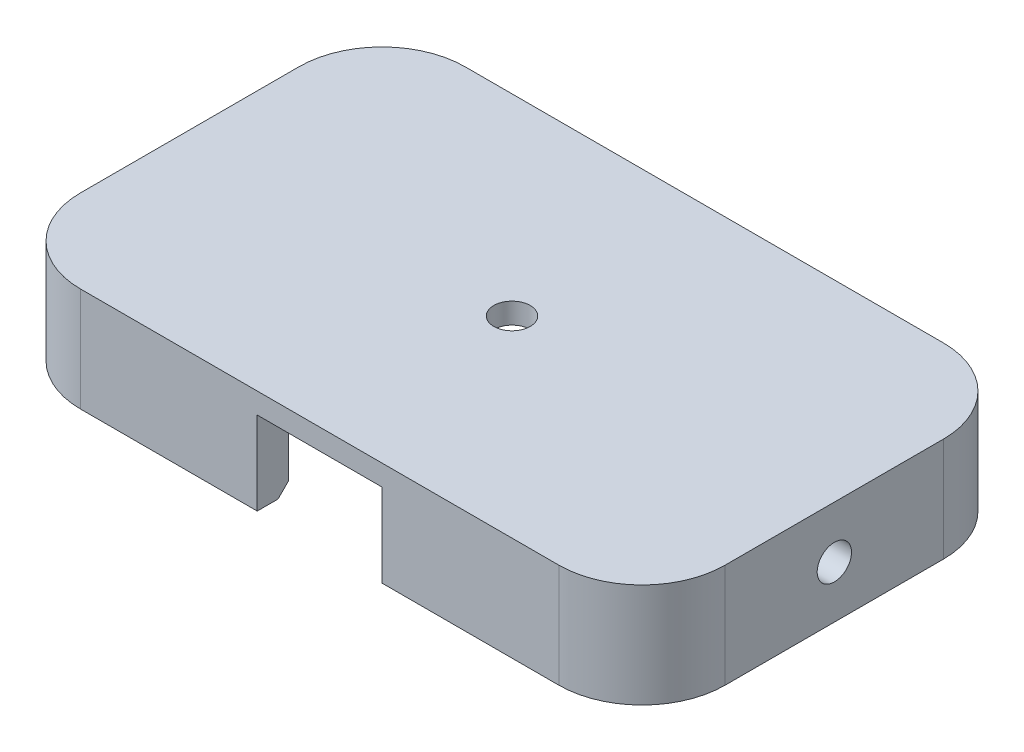
ISO-10303-21;
HEADER;
FILE_DESCRIPTION(('STEP AP214'),'2;1');
FILE_NAME('part.step','',(''),(''),'','','');
FILE_SCHEMA(('AUTOMOTIVE_DESIGN { 1 0 10303 214 1 1 1 1 }'));
ENDSEC;
DATA;
#1=APPLICATION_CONTEXT('core data for automotive mechanical design processes');
#2=APPLICATION_PROTOCOL_DEFINITION('international standard','automotive_design',2000,#1);
#3=PRODUCT_CONTEXT('',#1,'mechanical');
#4=PRODUCT('Part','Part','',(#3));
#5=PRODUCT_RELATED_PRODUCT_CATEGORY('part','',(#4));
#6=PRODUCT_DEFINITION_FORMATION('','',#4);
#7=PRODUCT_DEFINITION_CONTEXT('part definition',#1,'design');
#8=PRODUCT_DEFINITION('design','',#6,#7);
#9=PRODUCT_DEFINITION_SHAPE('','',#8);
#10=(LENGTH_UNIT() NAMED_UNIT(*) SI_UNIT(.MILLI.,.METRE.));
#11=(NAMED_UNIT(*) PLANE_ANGLE_UNIT() SI_UNIT($,.RADIAN.));
#12=(NAMED_UNIT(*) SI_UNIT($,.STERADIAN.) SOLID_ANGLE_UNIT());
#13=UNCERTAINTY_MEASURE_WITH_UNIT(LENGTH_MEASURE(1.E-05),#10,'distance_accuracy_value','');
#14=(GEOMETRIC_REPRESENTATION_CONTEXT(3) GLOBAL_UNCERTAINTY_ASSIGNED_CONTEXT((#13)) GLOBAL_UNIT_ASSIGNED_CONTEXT((#10,
#11,#12)) REPRESENTATION_CONTEXT('',''));
#15=CARTESIAN_POINT('',(0.,0.,0.));
#16=DIRECTION('',(0.,0.,1.));
#17=DIRECTION('',(1.,0.,0.));
#18=AXIS2_PLACEMENT_3D('',#15,#16,#17);
#19=CARTESIAN_POINT('',(-23.,-10.,15.5));
#20=DIRECTION('',(0.,0.,1.));
#21=DIRECTION('',(1.,0.,0.));
#22=AXIS2_PLACEMENT_3D('',#19,#20,#21);
#23=PLANE('',#22);
#24=DIRECTION('',(0.,-1.,0.));
#25=VECTOR('',#24,1.);
#26=CARTESIAN_POINT('',(-6.,-10.,15.5));
#27=LINE('',#26,#25);
#28=CARTESIAN_POINT('',(-6.,-2.,15.5));
#29=VERTEX_POINT('',#28);
#30=CARTESIAN_POINT('',(-6.,-9.,15.5));
#31=VERTEX_POINT('',#30);
#32=EDGE_CURVE('E357',#29,#31,#27,.T.);
#33=ORIENTED_EDGE('',*,*,#32,.T.);
#34=DIRECTION('',(-1.,0.,0.));
#35=VECTOR('',#34,1.);
#36=CARTESIAN_POINT('',(-23.,-9.,15.5));
#37=LINE('',#36,#35);
#38=CARTESIAN_POINT('',(-23.,-9.,15.5));
#39=VERTEX_POINT('',#38);
#40=EDGE_CURVE('E323',#31,#39,#37,.T.);
#41=ORIENTED_EDGE('',*,*,#40,.T.);
#42=DIRECTION('',(0.,1.,0.));
#43=VECTOR('',#42,1.);
#44=CARTESIAN_POINT('',(-23.,-10.,15.5));
#45=LINE('',#44,#43);
#46=CARTESIAN_POINT('',(-23.,-2.,15.5));
#47=VERTEX_POINT('',#46);
#48=EDGE_CURVE('E413',#39,#47,#45,.T.);
#49=ORIENTED_EDGE('',*,*,#48,.T.);
#50=DIRECTION('',(1.,0.,0.));
#51=VECTOR('',#50,1.);
#52=CARTESIAN_POINT('',(0.,-2.,15.5));
#53=LINE('',#52,#51);
#54=EDGE_CURVE('E361',#47,#29,#53,.T.);
#55=ORIENTED_EDGE('',*,*,#54,.T.);
#56=EDGE_LOOP('',(#33,#41,#49,#55));
#57=FACE_BOUND('',#56,.T.);
#58=ADVANCED_FACE('F36',(#57),#23,.F.);
#59=CARTESIAN_POINT('',(23.,-10.,-10.5));
#60=DIRECTION('',(0.,1.,0.));
#61=DIRECTION('',(0.,0.,1.));
#62=AXIS2_PLACEMENT_3D('',#59,#60,#61);
#63=CYLINDRICAL_SURFACE('',#62,5.);
#64=DIRECTION('',(0.,1.,0.));
#65=VECTOR('',#64,1.);
#66=CARTESIAN_POINT('',(23.,-10.,-15.5));
#67=LINE('',#66,#65);
#68=CARTESIAN_POINT('',(23.,-9.,-15.5));
#69=VERTEX_POINT('',#68);
#70=CARTESIAN_POINT('',(23.,-2.,-15.5));
#71=VERTEX_POINT('',#70);
#72=EDGE_CURVE('E407',#69,#71,#67,.T.);
#73=ORIENTED_EDGE('',*,*,#72,.F.);
#74=CARTESIAN_POINT('',(23.,-9.,-10.5));
#75=DIRECTION('',(0.,-1.,0.));
#76=DIRECTION('',(0.,0.,-1.));
#77=AXIS2_PLACEMENT_3D('',#74,#75,#76);
#78=CIRCLE('',#77,5.);
#79=CARTESIAN_POINT('',(28.,-9.,-10.5));
#80=VERTEX_POINT('',#79);
#81=EDGE_CURVE('E317',#69,#80,#78,.T.);
#82=ORIENTED_EDGE('',*,*,#81,.T.);
#83=DIRECTION('',(0.,1.,0.));
#84=VECTOR('',#83,1.);
#85=CARTESIAN_POINT('',(28.,-10.,-10.5));
#86=LINE('',#85,#84);
#87=CARTESIAN_POINT('',(28.,-2.,-10.5));
#88=VERTEX_POINT('',#87);
#89=EDGE_CURVE('E255',#80,#88,#86,.T.);
#90=ORIENTED_EDGE('',*,*,#89,.T.);
#91=CARTESIAN_POINT('',(23.,-2.,-10.5));
#92=DIRECTION('',(0.,1.,0.));
#93=DIRECTION('',(0.,0.,1.));
#94=AXIS2_PLACEMENT_3D('',#91,#92,#93);
#95=CIRCLE('',#94,5.);
#96=EDGE_CURVE('E401',#71,#88,#95,.F.);
#97=ORIENTED_EDGE('',*,*,#96,.F.);
#98=EDGE_LOOP('',(#73,#82,#90,#97));
#99=FACE_BOUND('',#98,.T.);
#100=ADVANCED_FACE('F523',(#99),#63,.F.);
#101=CARTESIAN_POINT('',(28.,-10.,10.5));
#102=DIRECTION('',(1.,0.,0.));
#103=DIRECTION('',(0.,0.,-1.));
#104=AXIS2_PLACEMENT_3D('',#101,#102,#103);
#105=PLANE('',#104);
#106=CARTESIAN_POINT('',(28.,-5.,0.));
#107=DIRECTION('',(1.,0.,0.));
#108=DIRECTION('',(0.,0.,-1.));
#109=AXIS2_PLACEMENT_3D('',#106,#107,#108);
#110=CIRCLE('',#109,1.65);
#111=CARTESIAN_POINT('',(28.,-5.,-1.64999999999999));
#112=VERTEX_POINT('',#111);
#113=EDGE_CURVE('E381',#112,#112,#110,.T.);
#114=ORIENTED_EDGE('',*,*,#113,.T.);
#115=EDGE_LOOP('',(#114));
#116=FACE_BOUND('',#115,.T.);
#117=ORIENTED_EDGE('',*,*,#89,.F.);
#118=DIRECTION('',(0.,0.,1.));
#119=VECTOR('',#118,1.);
#120=CARTESIAN_POINT('',(28.,-9.,10.5));
#121=LINE('',#120,#119);
#122=CARTESIAN_POINT('',(28.,-9.,10.5));
#123=VERTEX_POINT('',#122);
#124=EDGE_CURVE('E315',#80,#123,#121,.T.);
#125=ORIENTED_EDGE('',*,*,#124,.T.);
#126=DIRECTION('',(0.,1.,0.));
#127=VECTOR('',#126,1.);
#128=CARTESIAN_POINT('',(28.,-10.,10.5));
#129=LINE('',#128,#127);
#130=CARTESIAN_POINT('',(28.,-2.,10.5));
#131=VERTEX_POINT('',#130);
#132=EDGE_CURVE('E409',#123,#131,#129,.T.);
#133=ORIENTED_EDGE('',*,*,#132,.T.);
#134=DIRECTION('',(0.,0.,-1.));
#135=VECTOR('',#134,1.);
#136=CARTESIAN_POINT('',(28.,-2.,0.));
#137=LINE('',#136,#135);
#138=EDGE_CURVE('E398',#131,#88,#137,.T.);
#139=ORIENTED_EDGE('',*,*,#138,.T.);
#140=EDGE_LOOP('',(#117,#125,#133,#139));
#141=FACE_BOUND('',#140,.T.);
#142=ADVANCED_FACE('F497',(#116,#141),#105,.F.);
#143=CARTESIAN_POINT('',(23.,-10.,10.5));
#144=DIRECTION('',(0.,1.,0.));
#145=DIRECTION('',(0.,0.,1.));
#146=AXIS2_PLACEMENT_3D('',#143,#144,#145);
#147=CYLINDRICAL_SURFACE('',#146,5.);
#148=ORIENTED_EDGE('',*,*,#132,.F.);
#149=CARTESIAN_POINT('',(23.,-9.,10.5));
#150=DIRECTION('',(0.,-1.,0.));
#151=DIRECTION('',(0.,0.,-1.));
#152=AXIS2_PLACEMENT_3D('',#149,#150,#151);
#153=CIRCLE('',#152,5.);
#154=CARTESIAN_POINT('',(23.,-9.,15.5));
#155=VERTEX_POINT('',#154);
#156=EDGE_CURVE('E313',#123,#155,#153,.T.);
#157=ORIENTED_EDGE('',*,*,#156,.T.);
#158=DIRECTION('',(0.,1.,0.));
#159=VECTOR('',#158,1.);
#160=CARTESIAN_POINT('',(23.,-10.,15.5));
#161=LINE('',#160,#159);
#162=CARTESIAN_POINT('',(23.,-2.,15.5));
#163=VERTEX_POINT('',#162);
#164=EDGE_CURVE('E411',#155,#163,#161,.T.);
#165=ORIENTED_EDGE('',*,*,#164,.T.);
#166=CARTESIAN_POINT('',(23.,-2.,10.5));
#167=DIRECTION('',(0.,1.,0.));
#168=DIRECTION('',(0.,0.,1.));
#169=AXIS2_PLACEMENT_3D('',#166,#167,#168);
#170=CIRCLE('',#169,5.);
#171=EDGE_CURVE('E395',#131,#163,#170,.F.);
#172=ORIENTED_EDGE('',*,*,#171,.F.);
#173=EDGE_LOOP('',(#148,#157,#165,#172));
#174=FACE_BOUND('',#173,.T.);
#175=ADVANCED_FACE('F484',(#174),#147,.F.);
#176=ORIENTED_EDGE('',*,*,#164,.F.);
#177=DIRECTION('',(-1.,0.,0.));
#178=VECTOR('',#177,1.);
#179=CARTESIAN_POINT('',(6.,-9.,15.5));
#180=LINE('',#179,#178);
#181=CARTESIAN_POINT('',(6.,-9.,15.5));
#182=VERTEX_POINT('',#181);
#183=EDGE_CURVE('E309',#155,#182,#180,.T.);
#184=ORIENTED_EDGE('',*,*,#183,.T.);
#185=DIRECTION('',(0.,1.,0.));
#186=VECTOR('',#185,1.);
#187=CARTESIAN_POINT('',(6.,-10.,15.5));
#188=LINE('',#187,#186);
#189=CARTESIAN_POINT('',(6.,-2.,15.5));
#190=VERTEX_POINT('',#189);
#191=EDGE_CURVE('E363',#182,#190,#188,.T.);
#192=ORIENTED_EDGE('',*,*,#191,.T.);
#193=EDGE_CURVE('E393',#190,#163,#53,.T.);
#194=ORIENTED_EDGE('',*,*,#193,.T.);
#195=EDGE_LOOP('',(#176,#184,#192,#194));
#196=FACE_BOUND('',#195,.T.);
#197=ADVANCED_FACE('F488',(#196),#23,.F.);
#198=CARTESIAN_POINT('',(-23.,-10.,10.5));
#199=DIRECTION('',(0.,1.,0.));
#200=DIRECTION('',(0.,0.,1.));
#201=AXIS2_PLACEMENT_3D('',#198,#199,#200);
#202=CYLINDRICAL_SURFACE('',#201,5.);
#203=ORIENTED_EDGE('',*,*,#48,.F.);
#204=CARTESIAN_POINT('',(-23.,-9.,10.5));
#205=DIRECTION('',(0.,-1.,0.));
#206=DIRECTION('',(0.,0.,-1.));
#207=AXIS2_PLACEMENT_3D('',#204,#205,#206);
#208=CIRCLE('',#207,5.);
#209=CARTESIAN_POINT('',(-28.,-9.,10.5));
#210=VERTEX_POINT('',#209);
#211=EDGE_CURVE('E46',#39,#210,#208,.T.);
#212=ORIENTED_EDGE('',*,*,#211,.T.);
#213=DIRECTION('',(0.,1.,0.));
#214=VECTOR('',#213,1.);
#215=CARTESIAN_POINT('',(-28.,-10.,10.5));
#216=LINE('',#215,#214);
#217=CARTESIAN_POINT('',(-28.,-2.,10.5));
#218=VERTEX_POINT('',#217);
#219=EDGE_CURVE('E415',#210,#218,#216,.T.);
#220=ORIENTED_EDGE('',*,*,#219,.T.);
#221=CARTESIAN_POINT('',(-23.,-2.,10.5));
#222=DIRECTION('',(0.,1.,0.));
#223=DIRECTION('',(0.,0.,1.));
#224=AXIS2_PLACEMENT_3D('',#221,#222,#223);
#225=CIRCLE('',#224,5.);
#226=EDGE_CURVE('E390',#47,#218,#225,.F.);
#227=ORIENTED_EDGE('',*,*,#226,.F.);
#228=EDGE_LOOP('',(#203,#212,#220,#227));
#229=FACE_BOUND('',#228,.T.);
#230=ADVANCED_FACE('F532',(#229),#202,.F.);
#231=CARTESIAN_POINT('',(-28.,-10.,10.5));
#232=DIRECTION('',(-1.,0.,0.));
#233=DIRECTION('',(0.,0.,1.));
#234=AXIS2_PLACEMENT_3D('',#231,#232,#233);
#235=PLANE('',#234);
#236=CARTESIAN_POINT('',(-28.,-5.,0.));
#237=DIRECTION('',(-1.,0.,0.));
#238=DIRECTION('',(0.,0.,1.));
#239=AXIS2_PLACEMENT_3D('',#236,#237,#238);
#240=CIRCLE('',#239,1.65);
#241=CARTESIAN_POINT('',(-28.,-5.,1.65000000000001));
#242=VERTEX_POINT('',#241);
#243=EDGE_CURVE('E375',#242,#242,#240,.T.);
#244=ORIENTED_EDGE('',*,*,#243,.T.);
#245=EDGE_LOOP('',(#244));
#246=FACE_BOUND('',#245,.T.);
#247=ORIENTED_EDGE('',*,*,#219,.F.);
#248=DIRECTION('',(0.,0.,-1.));
#249=VECTOR('',#248,1.);
#250=CARTESIAN_POINT('',(-28.,-9.,-10.5));
#251=LINE('',#250,#249);
#252=CARTESIAN_POINT('',(-28.,-9.,-10.5));
#253=VERTEX_POINT('',#252);
#254=EDGE_CURVE('E11',#210,#253,#251,.T.);
#255=ORIENTED_EDGE('',*,*,#254,.T.);
#256=DIRECTION('',(0.,1.,0.));
#257=VECTOR('',#256,1.);
#258=CARTESIAN_POINT('',(-28.,-10.,-10.5));
#259=LINE('',#258,#257);
#260=CARTESIAN_POINT('',(-28.,-2.,-10.5));
#261=VERTEX_POINT('',#260);
#262=EDGE_CURVE('E417',#253,#261,#259,.T.);
#263=ORIENTED_EDGE('',*,*,#262,.T.);
#264=DIRECTION('',(0.,0.,-1.));
#265=VECTOR('',#264,1.);
#266=CARTESIAN_POINT('',(-28.,-2.,0.));
#267=LINE('',#266,#265);
#268=EDGE_CURVE('E387',#218,#261,#267,.T.);
#269=ORIENTED_EDGE('',*,*,#268,.F.);
#270=EDGE_LOOP('',(#247,#255,#263,#269));
#271=FACE_BOUND('',#270,.T.);
#272=ADVANCED_FACE('F537',(#246,#271),#235,.F.);
#273=CARTESIAN_POINT('',(-23.,-10.,-10.5));
#274=DIRECTION('',(0.,1.,0.));
#275=DIRECTION('',(0.,0.,1.));
#276=AXIS2_PLACEMENT_3D('',#273,#274,#275);
#277=CYLINDRICAL_SURFACE('',#276,5.);
#278=ORIENTED_EDGE('',*,*,#262,.F.);
#279=CARTESIAN_POINT('',(-23.,-9.,-10.5));
#280=DIRECTION('',(0.,-1.,0.));
#281=DIRECTION('',(0.,0.,-1.));
#282=AXIS2_PLACEMENT_3D('',#279,#280,#281);
#283=CIRCLE('',#282,5.);
#284=CARTESIAN_POINT('',(-23.,-9.,-15.5));
#285=VERTEX_POINT('',#284);
#286=EDGE_CURVE('E325',#253,#285,#283,.T.);
#287=ORIENTED_EDGE('',*,*,#286,.T.);
#288=DIRECTION('',(0.,1.,0.));
#289=VECTOR('',#288,1.);
#290=CARTESIAN_POINT('',(-23.,-10.,-15.5));
#291=LINE('',#290,#289);
#292=CARTESIAN_POINT('',(-23.,-2.,-15.5));
#293=VERTEX_POINT('',#292);
#294=EDGE_CURVE('E419',#285,#293,#291,.T.);
#295=ORIENTED_EDGE('',*,*,#294,.T.);
#296=CARTESIAN_POINT('',(-23.,-2.,-10.5));
#297=DIRECTION('',(0.,1.,0.));
#298=DIRECTION('',(0.,0.,1.));
#299=AXIS2_PLACEMENT_3D('',#296,#297,#298);
#300=CIRCLE('',#299,5.);
#301=EDGE_CURVE('E384',#261,#293,#300,.F.);
#302=ORIENTED_EDGE('',*,*,#301,.F.);
#303=EDGE_LOOP('',(#278,#287,#295,#302));
#304=FACE_BOUND('',#303,.T.);
#305=ADVANCED_FACE('F679',(#304),#277,.F.);
#306=CARTESIAN_POINT('',(-23.,-10.,-15.5));
#307=DIRECTION('',(0.,0.,-1.));
#308=DIRECTION('',(-1.,0.,0.));
#309=AXIS2_PLACEMENT_3D('',#306,#307,#308);
#310=PLANE('',#309);
#311=ORIENTED_EDGE('',*,*,#294,.F.);
#312=DIRECTION('',(1.,0.,0.));
#313=VECTOR('',#312,1.);
#314=CARTESIAN_POINT('',(23.,-9.,-15.5));
#315=LINE('',#314,#313);
#316=EDGE_CURVE('E319',#285,#69,#315,.T.);
#317=ORIENTED_EDGE('',*,*,#316,.T.);
#318=ORIENTED_EDGE('',*,*,#72,.T.);
#319=DIRECTION('',(1.,0.,0.));
#320=VECTOR('',#319,1.);
#321=CARTESIAN_POINT('',(0.,-2.,-15.5));
#322=LINE('',#321,#320);
#323=EDGE_CURVE('E404',#293,#71,#322,.T.);
#324=ORIENTED_EDGE('',*,*,#323,.F.);
#325=EDGE_LOOP('',(#311,#317,#318,#324));
#326=FACE_BOUND('',#325,.T.);
#327=ADVANCED_FACE('F653',(#326),#310,.F.);
#328=CARTESIAN_POINT('',(-23.,-10.,-10.5));
#329=DIRECTION('',(0.,1.,0.));
#330=DIRECTION('',(0.,0.,1.));
#331=AXIS2_PLACEMENT_3D('',#328,#329,#330);
#332=CYLINDRICAL_SURFACE('',#331,8.);
#333=CARTESIAN_POINT('',(-23.,0.,-10.5));
#334=DIRECTION('',(0.,1.,0.));
#335=DIRECTION('',(0.,0.,-1.));
#336=AXIS2_PLACEMENT_3D('',#333,#334,#335);
#337=CIRCLE('',#336,8.);
#338=CARTESIAN_POINT('',(-23.,0.,-18.5));
#339=VERTEX_POINT('',#338);
#340=CARTESIAN_POINT('',(-31.,0.,-10.5));
#341=VERTEX_POINT('',#340);
#342=EDGE_CURVE('E251',#339,#341,#337,.T.);
#343=ORIENTED_EDGE('',*,*,#342,.F.);
#344=DIRECTION('',(0.,1.,0.));
#345=VECTOR('',#344,1.);
#346=CARTESIAN_POINT('',(-23.,-10.,-18.5));
#347=LINE('',#346,#345);
#348=CARTESIAN_POINT('',(-23.,-10.,-18.5));
#349=VERTEX_POINT('',#348);
#350=EDGE_CURVE('E277',#349,#339,#347,.T.);
#351=ORIENTED_EDGE('',*,*,#350,.F.);
#352=CARTESIAN_POINT('',(-23.,-10.,-10.5));
#353=DIRECTION('',(0.,1.,0.));
#354=DIRECTION('',(0.,0.,-1.));
#355=AXIS2_PLACEMENT_3D('',#352,#353,#354);
#356=CIRCLE('',#355,8.);
#357=CARTESIAN_POINT('',(-31.,-10.,-10.5));
#358=VERTEX_POINT('',#357);
#359=EDGE_CURVE('E276',#349,#358,#356,.T.);
#360=ORIENTED_EDGE('',*,*,#359,.T.);
#361=DIRECTION('',(0.,1.,0.));
#362=VECTOR('',#361,1.);
#363=CARTESIAN_POINT('',(-31.,-10.,-10.5));
#364=LINE('',#363,#362);
#365=EDGE_CURVE('E250',#358,#341,#364,.T.);
#366=ORIENTED_EDGE('',*,*,#365,.T.);
#367=EDGE_LOOP('',(#343,#351,#360,#366));
#368=FACE_BOUND('',#367,.T.);
#369=ADVANCED_FACE('F434',(#368),#332,.T.);
#370=CARTESIAN_POINT('',(-23.,-10.,-18.5));
#371=DIRECTION('',(0.,0.,-1.));
#372=DIRECTION('',(-1.,0.,0.));
#373=AXIS2_PLACEMENT_3D('',#370,#371,#372);
#374=PLANE('',#373);
#375=DIRECTION('',(-1.,0.,0.));
#376=VECTOR('',#375,1.);
#377=CARTESIAN_POINT('',(-23.,0.,-18.5));
#378=LINE('',#377,#376);
#379=CARTESIAN_POINT('',(23.,0.,-18.5));
#380=VERTEX_POINT('',#379);
#381=EDGE_CURVE('E273',#380,#339,#378,.T.);
#382=ORIENTED_EDGE('',*,*,#381,.F.);
#383=DIRECTION('',(0.,1.,0.));
#384=VECTOR('',#383,1.);
#385=CARTESIAN_POINT('',(23.,-10.,-18.5));
#386=LINE('',#385,#384);
#387=CARTESIAN_POINT('',(23.,-10.,-18.5));
#388=VERTEX_POINT('',#387);
#389=EDGE_CURVE('E280',#388,#380,#386,.T.);
#390=ORIENTED_EDGE('',*,*,#389,.F.);
#391=DIRECTION('',(-1.,0.,0.));
#392=VECTOR('',#391,1.);
#393=CARTESIAN_POINT('',(-23.,-10.,-18.5));
#394=LINE('',#393,#392);
#395=EDGE_CURVE('E247',#388,#349,#394,.T.);
#396=ORIENTED_EDGE('',*,*,#395,.T.);
#397=ORIENTED_EDGE('',*,*,#350,.T.);
#398=EDGE_LOOP('',(#382,#390,#396,#397));
#399=FACE_BOUND('',#398,.T.);
#400=ADVANCED_FACE('F438',(#399),#374,.T.);
#401=CARTESIAN_POINT('',(23.,-10.,-10.5));
#402=DIRECTION('',(0.,1.,0.));
#403=DIRECTION('',(0.,0.,1.));
#404=AXIS2_PLACEMENT_3D('',#401,#402,#403);
#405=CYLINDRICAL_SURFACE('',#404,8.);
#406=CARTESIAN_POINT('',(23.,0.,-10.5));
#407=DIRECTION('',(0.,1.,0.));
#408=DIRECTION('',(0.,0.,-1.));
#409=AXIS2_PLACEMENT_3D('',#406,#407,#408);
#410=CIRCLE('',#409,8.);
#411=CARTESIAN_POINT('',(31.,0.,-10.5));
#412=VERTEX_POINT('',#411);
#413=EDGE_CURVE('E270',#412,#380,#410,.T.);
#414=ORIENTED_EDGE('',*,*,#413,.F.);
#415=DIRECTION('',(0.,1.,0.));
#416=VECTOR('',#415,1.);
#417=CARTESIAN_POINT('',(31.,-10.,-10.5));
#418=LINE('',#417,#416);
#419=CARTESIAN_POINT('',(31.,-10.,-10.5));
#420=VERTEX_POINT('',#419);
#421=EDGE_CURVE('E282',#420,#412,#418,.T.);
#422=ORIENTED_EDGE('',*,*,#421,.F.);
#423=CARTESIAN_POINT('',(23.,-10.,-10.5));
#424=DIRECTION('',(0.,1.,0.));
#425=DIRECTION('',(0.,0.,-1.));
#426=AXIS2_PLACEMENT_3D('',#423,#424,#425);
#427=CIRCLE('',#426,8.);
#428=EDGE_CURVE('E244',#420,#388,#427,.T.);
#429=ORIENTED_EDGE('',*,*,#428,.T.);
#430=ORIENTED_EDGE('',*,*,#389,.T.);
#431=EDGE_LOOP('',(#414,#422,#429,#430));
#432=FACE_BOUND('',#431,.T.);
#433=ADVANCED_FACE('F666',(#432),#405,.T.);
#434=CARTESIAN_POINT('',(31.,-10.,10.5));
#435=DIRECTION('',(1.,0.,0.));
#436=DIRECTION('',(0.,0.,-1.));
#437=AXIS2_PLACEMENT_3D('',#434,#435,#436);
#438=PLANE('',#437);
#439=CARTESIAN_POINT('',(31.,-5.,0.));
#440=DIRECTION('',(1.,0.,0.));
#441=DIRECTION('',(0.,0.,-1.));
#442=AXIS2_PLACEMENT_3D('',#439,#440,#441);
#443=CIRCLE('',#442,1.65);
#444=CARTESIAN_POINT('',(31.,-5.,-1.64999999999999));
#445=VERTEX_POINT('',#444);
#446=EDGE_CURVE('E378',#445,#445,#443,.T.);
#447=ORIENTED_EDGE('',*,*,#446,.F.);
#448=EDGE_LOOP('',(#447));
#449=FACE_BOUND('',#448,.T.);
#450=DIRECTION('',(0.,0.,-1.));
#451=VECTOR('',#450,1.);
#452=CARTESIAN_POINT('',(31.,0.,10.5));
#453=LINE('',#452,#451);
#454=CARTESIAN_POINT('',(31.,0.,10.5));
#455=VERTEX_POINT('',#454);
#456=EDGE_CURVE('E267',#455,#412,#453,.T.);
#457=ORIENTED_EDGE('',*,*,#456,.F.);
#458=DIRECTION('',(0.,1.,0.));
#459=VECTOR('',#458,1.);
#460=CARTESIAN_POINT('',(31.,-10.,10.5));
#461=LINE('',#460,#459);
#462=CARTESIAN_POINT('',(31.,-10.,10.5));
#463=VERTEX_POINT('',#462);
#464=EDGE_CURVE('E284',#463,#455,#461,.T.);
#465=ORIENTED_EDGE('',*,*,#464,.F.);
#466=DIRECTION('',(0.,0.,-1.));
#467=VECTOR('',#466,1.);
#468=CARTESIAN_POINT('',(31.,-10.,10.5));
#469=LINE('',#468,#467);
#470=EDGE_CURVE('E236',#463,#420,#469,.T.);
#471=ORIENTED_EDGE('',*,*,#470,.T.);
#472=ORIENTED_EDGE('',*,*,#421,.T.);
#473=EDGE_LOOP('',(#457,#465,#471,#472));
#474=FACE_BOUND('',#473,.T.);
#475=ADVANCED_FACE('F445',(#449,#474),#438,.T.);
#476=CARTESIAN_POINT('',(23.,-10.,10.5));
#477=DIRECTION('',(0.,1.,0.));
#478=DIRECTION('',(0.,0.,1.));
#479=AXIS2_PLACEMENT_3D('',#476,#477,#478);
#480=CYLINDRICAL_SURFACE('',#479,8.);
#481=CARTESIAN_POINT('',(23.,0.,10.5));
#482=DIRECTION('',(0.,1.,0.));
#483=DIRECTION('',(0.,0.,-1.));
#484=AXIS2_PLACEMENT_3D('',#481,#482,#483);
#485=CIRCLE('',#484,8.);
#486=CARTESIAN_POINT('',(23.,0.,18.5));
#487=VERTEX_POINT('',#486);
#488=EDGE_CURVE('E264',#487,#455,#485,.T.);
#489=ORIENTED_EDGE('',*,*,#488,.F.);
#490=DIRECTION('',(0.,1.,0.));
#491=VECTOR('',#490,1.);
#492=CARTESIAN_POINT('',(23.,-10.,18.5));
#493=LINE('',#492,#491);
#494=CARTESIAN_POINT('',(23.,-10.,18.5));
#495=VERTEX_POINT('',#494);
#496=EDGE_CURVE('E286',#495,#487,#493,.T.);
#497=ORIENTED_EDGE('',*,*,#496,.F.);
#498=CARTESIAN_POINT('',(23.,-10.,10.5));
#499=DIRECTION('',(0.,1.,0.));
#500=DIRECTION('',(0.,0.,-1.));
#501=AXIS2_PLACEMENT_3D('',#498,#499,#500);
#502=CIRCLE('',#501,8.);
#503=EDGE_CURVE('E232',#495,#463,#502,.T.);
#504=ORIENTED_EDGE('',*,*,#503,.T.);
#505=ORIENTED_EDGE('',*,*,#464,.T.);
#506=EDGE_LOOP('',(#489,#497,#504,#505));
#507=FACE_BOUND('',#506,.T.);
#508=ADVANCED_FACE('F449',(#507),#480,.T.);
#509=CARTESIAN_POINT('',(-23.,-10.,18.5));
#510=DIRECTION('',(0.,0.,1.));
#511=DIRECTION('',(1.,0.,0.));
#512=AXIS2_PLACEMENT_3D('',#509,#510,#511);
#513=PLANE('',#512);
#514=DIRECTION('',(0.,-1.,0.));
#515=VECTOR('',#514,1.);
#516=CARTESIAN_POINT('',(-6.,-2.,18.5));
#517=LINE('',#516,#515);
#518=CARTESIAN_POINT('',(-6.,-2.,18.5));
#519=VERTEX_POINT('',#518);
#520=CARTESIAN_POINT('',(-6.,-10.,18.5));
#521=VERTEX_POINT('',#520);
#522=EDGE_CURVE('E220',#519,#521,#517,.T.);
#523=ORIENTED_EDGE('',*,*,#522,.F.);
#524=DIRECTION('',(-1.,0.,0.));
#525=VECTOR('',#524,1.);
#526=CARTESIAN_POINT('',(6.,-2.,18.5));
#527=LINE('',#526,#525);
#528=CARTESIAN_POINT('',(6.,-2.,18.5));
#529=VERTEX_POINT('',#528);
#530=EDGE_CURVE('E217',#529,#519,#527,.T.);
#531=ORIENTED_EDGE('',*,*,#530,.F.);
#532=DIRECTION('',(0.,1.,0.));
#533=VECTOR('',#532,1.);
#534=CARTESIAN_POINT('',(6.,-2.,18.5));
#535=LINE('',#534,#533);
#536=CARTESIAN_POINT('',(6.,-10.,18.5));
#537=VERTEX_POINT('',#536);
#538=EDGE_CURVE('E227',#537,#529,#535,.T.);
#539=ORIENTED_EDGE('',*,*,#538,.F.);
#540=DIRECTION('',(1.,0.,0.));
#541=VECTOR('',#540,1.);
#542=CARTESIAN_POINT('',(-23.,-10.,18.5));
#543=LINE('',#542,#541);
#544=EDGE_CURVE('E233',#537,#495,#543,.T.);
#545=ORIENTED_EDGE('',*,*,#544,.T.);
#546=ORIENTED_EDGE('',*,*,#496,.T.);
#547=DIRECTION('',(1.,0.,0.));
#548=VECTOR('',#547,1.);
#549=CARTESIAN_POINT('',(-23.,0.,18.5));
#550=LINE('',#549,#548);
#551=CARTESIAN_POINT('',(-23.,0.,18.5));
#552=VERTEX_POINT('',#551);
#553=EDGE_CURVE('E261',#552,#487,#550,.T.);
#554=ORIENTED_EDGE('',*,*,#553,.F.);
#555=DIRECTION('',(0.,1.,0.));
#556=VECTOR('',#555,1.);
#557=CARTESIAN_POINT('',(-23.,-10.,18.5));
#558=LINE('',#557,#556);
#559=CARTESIAN_POINT('',(-23.,-10.,18.5));
#560=VERTEX_POINT('',#559);
#561=EDGE_CURVE('E231',#560,#552,#558,.T.);
#562=ORIENTED_EDGE('',*,*,#561,.F.);
#563=EDGE_CURVE('E210',#560,#521,#543,.T.);
#564=ORIENTED_EDGE('',*,*,#563,.T.);
#565=EDGE_LOOP('',(#523,#531,#539,#545,#546,#554,#562,#564));
#566=FACE_BOUND('',#565,.T.);
#567=ADVANCED_FACE('F229',(#566),#513,.T.);
#568=CARTESIAN_POINT('',(-23.,-10.,10.5));
#569=DIRECTION('',(0.,1.,0.));
#570=DIRECTION('',(0.,0.,1.));
#571=AXIS2_PLACEMENT_3D('',#568,#569,#570);
#572=CYLINDRICAL_SURFACE('',#571,8.);
#573=CARTESIAN_POINT('',(-23.,0.,10.5));
#574=DIRECTION('',(0.,1.,0.));
#575=DIRECTION('',(0.,0.,-1.));
#576=AXIS2_PLACEMENT_3D('',#573,#574,#575);
#577=CIRCLE('',#576,8.);
#578=CARTESIAN_POINT('',(-31.,0.,10.5));
#579=VERTEX_POINT('',#578);
#580=EDGE_CURVE('E258',#579,#552,#577,.T.);
#581=ORIENTED_EDGE('',*,*,#580,.F.);
#582=DIRECTION('',(0.,1.,0.));
#583=VECTOR('',#582,1.);
#584=CARTESIAN_POINT('',(-31.,-10.,10.5));
#585=LINE('',#584,#583);
#586=CARTESIAN_POINT('',(-31.,-10.,10.5));
#587=VERTEX_POINT('',#586);
#588=EDGE_CURVE('E289',#587,#579,#585,.T.);
#589=ORIENTED_EDGE('',*,*,#588,.F.);
#590=CARTESIAN_POINT('',(-23.,-10.,10.5));
#591=DIRECTION('',(0.,1.,0.));
#592=DIRECTION('',(0.,0.,-1.));
#593=AXIS2_PLACEMENT_3D('',#590,#591,#592);
#594=CIRCLE('',#593,8.);
#595=EDGE_CURVE('E238',#587,#560,#594,.T.);
#596=ORIENTED_EDGE('',*,*,#595,.T.);
#597=ORIENTED_EDGE('',*,*,#561,.T.);
#598=EDGE_LOOP('',(#581,#589,#596,#597));
#599=FACE_BOUND('',#598,.T.);
#600=ADVANCED_FACE('F429',(#599),#572,.T.);
#601=CARTESIAN_POINT('',(-31.,-10.,10.5));
#602=DIRECTION('',(-1.,0.,0.));
#603=DIRECTION('',(0.,0.,1.));
#604=AXIS2_PLACEMENT_3D('',#601,#602,#603);
#605=PLANE('',#604);
#606=CARTESIAN_POINT('',(-31.,-5.,0.));
#607=DIRECTION('',(-1.,0.,0.));
#608=DIRECTION('',(0.,0.,1.));
#609=AXIS2_PLACEMENT_3D('',#606,#607,#608);
#610=CIRCLE('',#609,1.65);
#611=CARTESIAN_POINT('',(-31.,-5.,1.65000000000001));
#612=VERTEX_POINT('',#611);
#613=EDGE_CURVE('E372',#612,#612,#610,.T.);
#614=ORIENTED_EDGE('',*,*,#613,.F.);
#615=EDGE_LOOP('',(#614));
#616=FACE_BOUND('',#615,.T.);
#617=DIRECTION('',(0.,0.,1.));
#618=VECTOR('',#617,1.);
#619=CARTESIAN_POINT('',(-31.,0.,10.5));
#620=LINE('',#619,#618);
#621=EDGE_CURVE('E254',#341,#579,#620,.T.);
#622=ORIENTED_EDGE('',*,*,#621,.F.);
#623=ORIENTED_EDGE('',*,*,#365,.F.);
#624=DIRECTION('',(0.,0.,1.));
#625=VECTOR('',#624,1.);
#626=CARTESIAN_POINT('',(-31.,-10.,10.5));
#627=LINE('',#626,#625);
#628=EDGE_CURVE('E423',#358,#587,#627,.T.);
#629=ORIENTED_EDGE('',*,*,#628,.T.);
#630=ORIENTED_EDGE('',*,*,#588,.T.);
#631=EDGE_LOOP('',(#622,#623,#629,#630));
#632=FACE_BOUND('',#631,.T.);
#633=ADVANCED_FACE('F654',(#616,#632),#605,.T.);
#634=CARTESIAN_POINT('',(-23.,-10.,-10.5));
#635=DIRECTION('',(0.,-1.,0.));
#636=DIRECTION('',(0.,0.,-1.));
#637=AXIS2_PLACEMENT_3D('',#634,#635,#636);
#638=PLANE('',#637);
#639=DIRECTION('',(0.,0.,1.));
#640=VECTOR('',#639,1.);
#641=CARTESIAN_POINT('',(6.,-10.,13.5));
#642=LINE('',#641,#640);
#643=CARTESIAN_POINT('',(6.,-10.,16.5));
#644=VERTEX_POINT('',#643);
#645=EDGE_CURVE('E216',#644,#537,#642,.T.);
#646=ORIENTED_EDGE('',*,*,#645,.F.);
#647=DIRECTION('',(1.,0.,0.));
#648=VECTOR('',#647,1.);
#649=CARTESIAN_POINT('',(23.,-10.,16.5));
#650=LINE('',#649,#648);
#651=CARTESIAN_POINT('',(23.,-10.,16.5));
#652=VERTEX_POINT('',#651);
#653=EDGE_CURVE('E306',#644,#652,#650,.T.);
#654=ORIENTED_EDGE('',*,*,#653,.T.);
#655=CARTESIAN_POINT('',(23.,-10.,10.5));
#656=DIRECTION('',(0.,-1.,0.));
#657=DIRECTION('',(0.,0.,-1.));
#658=AXIS2_PLACEMENT_3D('',#655,#656,#657);
#659=CIRCLE('',#658,5.99999999999999);
#660=CARTESIAN_POINT('',(29.,-10.,10.5));
#661=VERTEX_POINT('',#660);
#662=EDGE_CURVE('E304',#652,#661,#659,.F.);
#663=ORIENTED_EDGE('',*,*,#662,.T.);
#664=DIRECTION('',(0.,0.,-1.));
#665=VECTOR('',#664,1.);
#666=CARTESIAN_POINT('',(29.,-10.,-10.5));
#667=LINE('',#666,#665);
#668=CARTESIAN_POINT('',(29.,-10.,-10.5));
#669=VERTEX_POINT('',#668);
#670=EDGE_CURVE('E302',#661,#669,#667,.T.);
#671=ORIENTED_EDGE('',*,*,#670,.T.);
#672=CARTESIAN_POINT('',(23.,-10.,-10.5));
#673=DIRECTION('',(0.,-1.,0.));
#674=DIRECTION('',(0.,0.,-1.));
#675=AXIS2_PLACEMENT_3D('',#672,#673,#674);
#676=CIRCLE('',#675,5.99999999999999);
#677=CARTESIAN_POINT('',(23.,-10.,-16.5));
#678=VERTEX_POINT('',#677);
#679=EDGE_CURVE('E300',#669,#678,#676,.F.);
#680=ORIENTED_EDGE('',*,*,#679,.T.);
#681=DIRECTION('',(-1.,0.,0.));
#682=VECTOR('',#681,1.);
#683=CARTESIAN_POINT('',(-23.,-10.,-16.5));
#684=LINE('',#683,#682);
#685=CARTESIAN_POINT('',(-23.,-10.,-16.5));
#686=VERTEX_POINT('',#685);
#687=EDGE_CURVE('E298',#678,#686,#684,.T.);
#688=ORIENTED_EDGE('',*,*,#687,.T.);
#689=CARTESIAN_POINT('',(-23.,-10.,-10.5));
#690=DIRECTION('',(0.,-1.,0.));
#691=DIRECTION('',(0.,0.,-1.));
#692=AXIS2_PLACEMENT_3D('',#689,#690,#691);
#693=CIRCLE('',#692,5.99999999999999);
#694=CARTESIAN_POINT('',(-29.,-10.,-10.5));
#695=VERTEX_POINT('',#694);
#696=EDGE_CURVE('E295',#686,#695,#693,.F.);
#697=ORIENTED_EDGE('',*,*,#696,.T.);
#698=DIRECTION('',(0.,0.,1.));
#699=VECTOR('',#698,1.);
#700=CARTESIAN_POINT('',(-29.,-10.,10.5));
#701=LINE('',#700,#699);
#702=CARTESIAN_POINT('',(-29.,-10.,10.5));
#703=VERTEX_POINT('',#702);
#704=EDGE_CURVE('E279',#695,#703,#701,.T.);
#705=ORIENTED_EDGE('',*,*,#704,.T.);
#706=CARTESIAN_POINT('',(-23.,-10.,10.5));
#707=DIRECTION('',(0.,-1.,0.));
#708=DIRECTION('',(0.,0.,-1.));
#709=AXIS2_PLACEMENT_3D('',#706,#707,#708);
#710=CIRCLE('',#709,5.99999999999999);
#711=CARTESIAN_POINT('',(-23.,-10.,16.5));
#712=VERTEX_POINT('',#711);
#713=EDGE_CURVE('E293',#703,#712,#710,.F.);
#714=ORIENTED_EDGE('',*,*,#713,.T.);
#715=DIRECTION('',(1.,0.,0.));
#716=VECTOR('',#715,1.);
#717=CARTESIAN_POINT('',(-6.,-10.,16.5));
#718=LINE('',#717,#716);
#719=CARTESIAN_POINT('',(-6.,-10.,16.5));
#720=VERTEX_POINT('',#719);
#721=EDGE_CURVE('E213',#712,#720,#718,.T.);
#722=ORIENTED_EDGE('',*,*,#721,.T.);
#723=DIRECTION('',(0.,0.,1.));
#724=VECTOR('',#723,1.);
#725=CARTESIAN_POINT('',(-6.,-10.,13.5));
#726=LINE('',#725,#724);
#727=EDGE_CURVE('E204',#720,#521,#726,.T.);
#728=ORIENTED_EDGE('',*,*,#727,.T.);
#729=ORIENTED_EDGE('',*,*,#563,.F.);
#730=ORIENTED_EDGE('',*,*,#595,.F.);
#731=ORIENTED_EDGE('',*,*,#628,.F.);
#732=ORIENTED_EDGE('',*,*,#359,.F.);
#733=ORIENTED_EDGE('',*,*,#395,.F.);
#734=ORIENTED_EDGE('',*,*,#428,.F.);
#735=ORIENTED_EDGE('',*,*,#470,.F.);
#736=ORIENTED_EDGE('',*,*,#503,.F.);
#737=ORIENTED_EDGE('',*,*,#544,.F.);
#738=EDGE_LOOP('',(#646,#654,#663,#671,#680,#688,#697,#705,#714,#722,#728,#729,#730,#731,#732,
#733,#734,#735,#736,#737));
#739=FACE_BOUND('',#738,.T.);
#740=ADVANCED_FACE('F207',(#739),#638,.T.);
#741=CARTESIAN_POINT('',(-23.,0.,-10.5));
#742=DIRECTION('',(0.,-1.,0.));
#743=DIRECTION('',(0.,0.,-1.));
#744=AXIS2_PLACEMENT_3D('',#741,#742,#743);
#745=PLANE('',#744);
#746=CARTESIAN_POINT('',(0.,0.,0.));
#747=DIRECTION('',(0.,-1.,0.));
#748=DIRECTION('',(0.,0.,-1.));
#749=AXIS2_PLACEMENT_3D('',#746,#747,#748);
#750=CIRCLE('',#749,1.75);
#751=CARTESIAN_POINT('',(0.,0.,-1.75));
#752=VERTEX_POINT('',#751);
#753=EDGE_CURVE('E366',#752,#752,#750,.T.);
#754=ORIENTED_EDGE('',*,*,#753,.T.);
#755=EDGE_LOOP('',(#754));
#756=FACE_BOUND('',#755,.T.);
#757=ORIENTED_EDGE('',*,*,#342,.T.);
#758=ORIENTED_EDGE('',*,*,#621,.T.);
#759=ORIENTED_EDGE('',*,*,#580,.T.);
#760=ORIENTED_EDGE('',*,*,#553,.T.);
#761=ORIENTED_EDGE('',*,*,#488,.T.);
#762=ORIENTED_EDGE('',*,*,#456,.T.);
#763=ORIENTED_EDGE('',*,*,#413,.T.);
#764=ORIENTED_EDGE('',*,*,#381,.T.);
#765=EDGE_LOOP('',(#757,#758,#759,#760,#761,#762,#763,#764));
#766=FACE_BOUND('',#765,.T.);
#767=ADVANCED_FACE('F547',(#756,#766),#745,.F.);
#768=CARTESIAN_POINT('',(0.,-2.,0.));
#769=DIRECTION('',(0.,1.,0.));
#770=DIRECTION('',(0.,0.,1.));
#771=AXIS2_PLACEMENT_3D('',#768,#769,#770);
#772=PLANE('',#771);
#773=ORIENTED_EDGE('',*,*,#193,.F.);
#774=DIRECTION('',(0.,0.,1.));
#775=VECTOR('',#774,1.);
#776=CARTESIAN_POINT('',(6.,-2.,13.5));
#777=LINE('',#776,#775);
#778=EDGE_CURVE('E461',#190,#529,#777,.T.);
#779=ORIENTED_EDGE('',*,*,#778,.T.);
#780=ORIENTED_EDGE('',*,*,#530,.T.);
#781=DIRECTION('',(0.,0.,1.));
#782=VECTOR('',#781,1.);
#783=CARTESIAN_POINT('',(-6.,-2.,13.5));
#784=LINE('',#783,#782);
#785=EDGE_CURVE('E223',#29,#519,#784,.T.);
#786=ORIENTED_EDGE('',*,*,#785,.F.);
#787=ORIENTED_EDGE('',*,*,#54,.F.);
#788=ORIENTED_EDGE('',*,*,#226,.T.);
#789=ORIENTED_EDGE('',*,*,#268,.T.);
#790=ORIENTED_EDGE('',*,*,#301,.T.);
#791=ORIENTED_EDGE('',*,*,#323,.T.);
#792=ORIENTED_EDGE('',*,*,#96,.T.);
#793=ORIENTED_EDGE('',*,*,#138,.F.);
#794=ORIENTED_EDGE('',*,*,#171,.T.);
#795=EDGE_LOOP('',(#773,#779,#780,#786,#787,#788,#789,#790,#791,#792,#793,#794));
#796=FACE_BOUND('',#795,.T.);
#797=CARTESIAN_POINT('',(0.,-2.,0.));
#798=DIRECTION('',(0.,-1.,0.));
#799=DIRECTION('',(0.,0.,-1.));
#800=AXIS2_PLACEMENT_3D('',#797,#798,#799);
#801=CIRCLE('',#800,1.74999999999999);
#802=CARTESIAN_POINT('',(0.,-2.,-1.74999999999999));
#803=VERTEX_POINT('',#802);
#804=EDGE_CURVE('E362',#803,#803,#801,.T.);
#805=ORIENTED_EDGE('',*,*,#804,.F.);
#806=EDGE_LOOP('',(#805));
#807=FACE_BOUND('',#806,.T.);
#808=ADVANCED_FACE('F492',(#796,#807),#772,.F.);
#809=CARTESIAN_POINT('',(31.,-5.,0.));
#810=DIRECTION('',(1.,0.,0.));
#811=DIRECTION('',(0.,0.,-1.));
#812=AXIS2_PLACEMENT_3D('',#809,#810,#811);
#813=CYLINDRICAL_SURFACE('',#812,1.65);
#814=ORIENTED_EDGE('',*,*,#446,.T.);
#815=EDGE_LOOP('',(#814));
#816=FACE_BOUND('',#815,.T.);
#817=ORIENTED_EDGE('',*,*,#113,.F.);
#818=EDGE_LOOP('',(#817));
#819=FACE_BOUND('',#818,.T.);
#820=ADVANCED_FACE('F546',(#816,#819),#813,.F.);
#821=CARTESIAN_POINT('',(-31.,-5.,0.));
#822=DIRECTION('',(-1.,0.,0.));
#823=DIRECTION('',(0.,0.,1.));
#824=AXIS2_PLACEMENT_3D('',#821,#822,#823);
#825=CYLINDRICAL_SURFACE('',#824,1.65);
#826=ORIENTED_EDGE('',*,*,#613,.T.);
#827=EDGE_LOOP('',(#826));
#828=FACE_BOUND('',#827,.T.);
#829=ORIENTED_EDGE('',*,*,#243,.F.);
#830=EDGE_LOOP('',(#829));
#831=FACE_BOUND('',#830,.T.);
#832=ADVANCED_FACE('F550',(#828,#831),#825,.F.);
#833=CARTESIAN_POINT('',(0.,-2.,0.));
#834=DIRECTION('',(0.,-1.,0.));
#835=DIRECTION('',(0.,0.,-1.));
#836=AXIS2_PLACEMENT_3D('',#833,#834,#835);
#837=CYLINDRICAL_SURFACE('',#836,1.75);
#838=ORIENTED_EDGE('',*,*,#753,.F.);
#839=EDGE_LOOP('',(#838));
#840=FACE_BOUND('',#839,.T.);
#841=ORIENTED_EDGE('',*,*,#804,.T.);
#842=EDGE_LOOP('',(#841));
#843=FACE_BOUND('',#842,.T.);
#844=ADVANCED_FACE('F554',(#840,#843),#837,.F.);
#845=CARTESIAN_POINT('',(-6.,-2.,13.5));
#846=DIRECTION('',(-1.,0.,0.));
#847=DIRECTION('',(0.,-1.,0.));
#848=AXIS2_PLACEMENT_3D('',#845,#846,#847);
#849=PLANE('',#848);
#850=ORIENTED_EDGE('',*,*,#727,.F.);
#851=DIRECTION('',(0.,0.70710678118655,-0.707106781186545));
#852=VECTOR('',#851,1.);
#853=CARTESIAN_POINT('',(-6.,-10.,16.5));
#854=LINE('',#853,#852);
#855=EDGE_CURVE('E321',#720,#31,#854,.T.);
#856=ORIENTED_EDGE('',*,*,#855,.T.);
#857=ORIENTED_EDGE('',*,*,#32,.F.);
#858=ORIENTED_EDGE('',*,*,#785,.T.);
#859=ORIENTED_EDGE('',*,*,#522,.T.);
#860=EDGE_LOOP('',(#850,#856,#857,#858,#859));
#861=FACE_BOUND('',#860,.T.);
#862=ADVANCED_FACE('F221',(#861),#849,.F.);
#863=CARTESIAN_POINT('',(6.,-2.,13.5));
#864=DIRECTION('',(1.,0.,0.));
#865=DIRECTION('',(0.,1.,0.));
#866=AXIS2_PLACEMENT_3D('',#863,#864,#865);
#867=PLANE('',#866);
#868=ORIENTED_EDGE('',*,*,#191,.F.);
#869=DIRECTION('',(0.,-0.70710678118655,0.707106781186545));
#870=VECTOR('',#869,1.);
#871=CARTESIAN_POINT('',(6.,-10.,16.5));
#872=LINE('',#871,#870);
#873=EDGE_CURVE('E311',#182,#644,#872,.T.);
#874=ORIENTED_EDGE('',*,*,#873,.T.);
#875=ORIENTED_EDGE('',*,*,#645,.T.);
#876=ORIENTED_EDGE('',*,*,#538,.T.);
#877=ORIENTED_EDGE('',*,*,#778,.F.);
#878=EDGE_LOOP('',(#868,#874,#875,#876,#877));
#879=FACE_BOUND('',#878,.T.);
#880=ADVANCED_FACE('F464',(#879),#867,.F.);
#881=CARTESIAN_POINT('',(-23.,-10.,16.5));
#882=DIRECTION('',(0.,-0.707106781186545,-0.70710678118655));
#883=DIRECTION('',(-1.,0.,0.));
#884=AXIS2_PLACEMENT_3D('',#881,#882,#883);
#885=PLANE('',#884);
#886=ORIENTED_EDGE('',*,*,#855,.F.);
#887=ORIENTED_EDGE('',*,*,#721,.F.);
#888=DIRECTION('',(0.,-0.70710678118655,0.707106781186545));
#889=VECTOR('',#888,1.);
#890=CARTESIAN_POINT('',(-23.,-9.,15.5));
#891=LINE('',#890,#889);
#892=EDGE_CURVE('E41',#39,#712,#891,.T.);
#893=ORIENTED_EDGE('',*,*,#892,.F.);
#894=ORIENTED_EDGE('',*,*,#40,.F.);
#895=EDGE_LOOP('',(#886,#887,#893,#894));
#896=FACE_BOUND('',#895,.T.);
#897=ADVANCED_FACE('F39',(#896),#885,.T.);
#898=CARTESIAN_POINT('',(-23.,-10.,10.5));
#899=DIRECTION('',(0.,-1.,0.));
#900=DIRECTION('',(0.,0.,-1.));
#901=AXIS2_PLACEMENT_3D('',#898,#899,#900);
#902=CONICAL_SURFACE('',#901,5.99999999999999,0.785398163397445);
#903=ORIENTED_EDGE('',*,*,#892,.T.);
#904=ORIENTED_EDGE('',*,*,#713,.F.);
#905=DIRECTION('',(-0.707106781186545,-0.70710678118655,0.));
#906=VECTOR('',#905,1.);
#907=CARTESIAN_POINT('',(-28.,-9.,10.5));
#908=LINE('',#907,#906);
#909=EDGE_CURVE('E344',#210,#703,#908,.T.);
#910=ORIENTED_EDGE('',*,*,#909,.F.);
#911=ORIENTED_EDGE('',*,*,#211,.F.);
#912=EDGE_LOOP('',(#903,#904,#910,#911));
#913=FACE_BOUND('',#912,.T.);
#914=ADVANCED_FACE('F353',(#913),#902,.F.);
#915=CARTESIAN_POINT('',(-29.,-10.,-10.5));
#916=DIRECTION('',(0.70710678118655,-0.707106781186545,0.));
#917=DIRECTION('',(0.,0.,-1.));
#918=AXIS2_PLACEMENT_3D('',#915,#916,#917);
#919=PLANE('',#918);
#920=ORIENTED_EDGE('',*,*,#909,.T.);
#921=ORIENTED_EDGE('',*,*,#704,.F.);
#922=DIRECTION('',(-0.707106781186545,-0.70710678118655,0.));
#923=VECTOR('',#922,1.);
#924=CARTESIAN_POINT('',(-28.,-9.,-10.5));
#925=LINE('',#924,#923);
#926=EDGE_CURVE('E342',#253,#695,#925,.T.);
#927=ORIENTED_EDGE('',*,*,#926,.F.);
#928=ORIENTED_EDGE('',*,*,#254,.F.);
#929=EDGE_LOOP('',(#920,#921,#927,#928));
#930=FACE_BOUND('',#929,.T.);
#931=ADVANCED_FACE('F513',(#930),#919,.T.);
#932=CARTESIAN_POINT('',(-23.,-10.,-10.5));
#933=DIRECTION('',(0.,-1.,0.));
#934=DIRECTION('',(0.,0.,-1.));
#935=AXIS2_PLACEMENT_3D('',#932,#933,#934);
#936=CONICAL_SURFACE('',#935,5.99999999999999,0.785398163397445);
#937=ORIENTED_EDGE('',*,*,#926,.T.);
#938=ORIENTED_EDGE('',*,*,#696,.F.);
#939=DIRECTION('',(0.,-0.70710678118655,-0.707106781186545));
#940=VECTOR('',#939,1.);
#941=CARTESIAN_POINT('',(-23.,-9.,-15.5));
#942=LINE('',#941,#940);
#943=EDGE_CURVE('E339',#285,#686,#942,.T.);
#944=ORIENTED_EDGE('',*,*,#943,.F.);
#945=ORIENTED_EDGE('',*,*,#286,.F.);
#946=EDGE_LOOP('',(#937,#938,#944,#945));
#947=FACE_BOUND('',#946,.T.);
#948=ADVANCED_FACE('F511',(#947),#936,.F.);
#949=CARTESIAN_POINT('',(-23.,-10.,-16.5));
#950=DIRECTION('',(0.,-0.707106781186545,0.70710678118655));
#951=DIRECTION('',(1.,0.,0.));
#952=AXIS2_PLACEMENT_3D('',#949,#950,#951);
#953=PLANE('',#952);
#954=ORIENTED_EDGE('',*,*,#943,.T.);
#955=ORIENTED_EDGE('',*,*,#687,.F.);
#956=DIRECTION('',(0.,-0.70710678118655,-0.707106781186545));
#957=VECTOR('',#956,1.);
#958=CARTESIAN_POINT('',(23.,-9.,-15.5));
#959=LINE('',#958,#957);
#960=EDGE_CURVE('E336',#69,#678,#959,.T.);
#961=ORIENTED_EDGE('',*,*,#960,.F.);
#962=ORIENTED_EDGE('',*,*,#316,.F.);
#963=EDGE_LOOP('',(#954,#955,#961,#962));
#964=FACE_BOUND('',#963,.T.);
#965=ADVANCED_FACE('F506',(#964),#953,.T.);
#966=CARTESIAN_POINT('',(23.,-10.,-10.5));
#967=DIRECTION('',(0.,-1.,0.));
#968=DIRECTION('',(0.,0.,-1.));
#969=AXIS2_PLACEMENT_3D('',#966,#967,#968);
#970=CONICAL_SURFACE('',#969,5.99999999999999,0.785398163397445);
#971=ORIENTED_EDGE('',*,*,#960,.T.);
#972=ORIENTED_EDGE('',*,*,#679,.F.);
#973=DIRECTION('',(0.707106781186545,-0.70710678118655,0.));
#974=VECTOR('',#973,1.);
#975=CARTESIAN_POINT('',(28.,-9.,-10.5));
#976=LINE('',#975,#974);
#977=EDGE_CURVE('E333',#80,#669,#976,.T.);
#978=ORIENTED_EDGE('',*,*,#977,.F.);
#979=ORIENTED_EDGE('',*,*,#81,.F.);
#980=EDGE_LOOP('',(#971,#972,#978,#979));
#981=FACE_BOUND('',#980,.T.);
#982=ADVANCED_FACE('F501',(#981),#970,.F.);
#983=CARTESIAN_POINT('',(29.,-10.,-10.5));
#984=DIRECTION('',(-0.707106781186551,-0.707106781186544,0.));
#985=DIRECTION('',(0.,0.,1.));
#986=AXIS2_PLACEMENT_3D('',#983,#984,#985);
#987=PLANE('',#986);
#988=ORIENTED_EDGE('',*,*,#977,.T.);
#989=ORIENTED_EDGE('',*,*,#670,.F.);
#990=DIRECTION('',(0.707106781186544,-0.707106781186551,0.));
#991=VECTOR('',#990,1.);
#992=CARTESIAN_POINT('',(28.,-9.,10.5));
#993=LINE('',#992,#991);
#994=EDGE_CURVE('E330',#123,#661,#993,.T.);
#995=ORIENTED_EDGE('',*,*,#994,.F.);
#996=ORIENTED_EDGE('',*,*,#124,.F.);
#997=EDGE_LOOP('',(#988,#989,#995,#996));
#998=FACE_BOUND('',#997,.T.);
#999=ADVANCED_FACE('F476',(#998),#987,.T.);
#1000=CARTESIAN_POINT('',(23.,-10.,10.5));
#1001=DIRECTION('',(0.,-1.,0.));
#1002=DIRECTION('',(0.,0.,-1.));
#1003=AXIS2_PLACEMENT_3D('',#1000,#1001,#1002);
#1004=CONICAL_SURFACE('',#1003,5.99999999999999,0.785398163397445);
#1005=ORIENTED_EDGE('',*,*,#994,.T.);
#1006=ORIENTED_EDGE('',*,*,#662,.F.);
#1007=DIRECTION('',(0.,-0.70710678118655,0.707106781186545));
#1008=VECTOR('',#1007,1.);
#1009=CARTESIAN_POINT('',(23.,-9.,15.5));
#1010=LINE('',#1009,#1008);
#1011=EDGE_CURVE('E328',#155,#652,#1010,.T.);
#1012=ORIENTED_EDGE('',*,*,#1011,.F.);
#1013=ORIENTED_EDGE('',*,*,#156,.F.);
#1014=EDGE_LOOP('',(#1005,#1006,#1012,#1013));
#1015=FACE_BOUND('',#1014,.T.);
#1016=ADVANCED_FACE('F480',(#1015),#1004,.F.);
#1017=CARTESIAN_POINT('',(-23.,-10.,16.5));
#1018=DIRECTION('',(0.,-0.707106781186545,-0.70710678118655));
#1019=DIRECTION('',(-1.,0.,0.));
#1020=AXIS2_PLACEMENT_3D('',#1017,#1018,#1019);
#1021=PLANE('',#1020);
#1022=ORIENTED_EDGE('',*,*,#873,.F.);
#1023=ORIENTED_EDGE('',*,*,#183,.F.);
#1024=ORIENTED_EDGE('',*,*,#1011,.T.);
#1025=ORIENTED_EDGE('',*,*,#653,.F.);
#1026=EDGE_LOOP('',(#1022,#1023,#1024,#1025));
#1027=FACE_BOUND('',#1026,.T.);
#1028=ADVANCED_FACE('F468',(#1027),#1021,.T.);
#1029=CLOSED_SHELL('',(#58,#100,#142,#175,#197,#230,#272,#305,#327,#369,#400,#433,#475,#508,
#567,#600,#633,#740,#767,#808,#820,#832,#844,#862,#880,#897,#914,#931,#948,#965,#982,#999,#1016,#1028));
#1030=MANIFOLD_SOLID_BREP('B2',#1029);
#1031=ADVANCED_BREP_SHAPE_REPRESENTATION('',(#18,#1030),#14);
#1032=SHAPE_DEFINITION_REPRESENTATION(#9,#1031);
ENDSEC;
END-ISO-10303-21;
